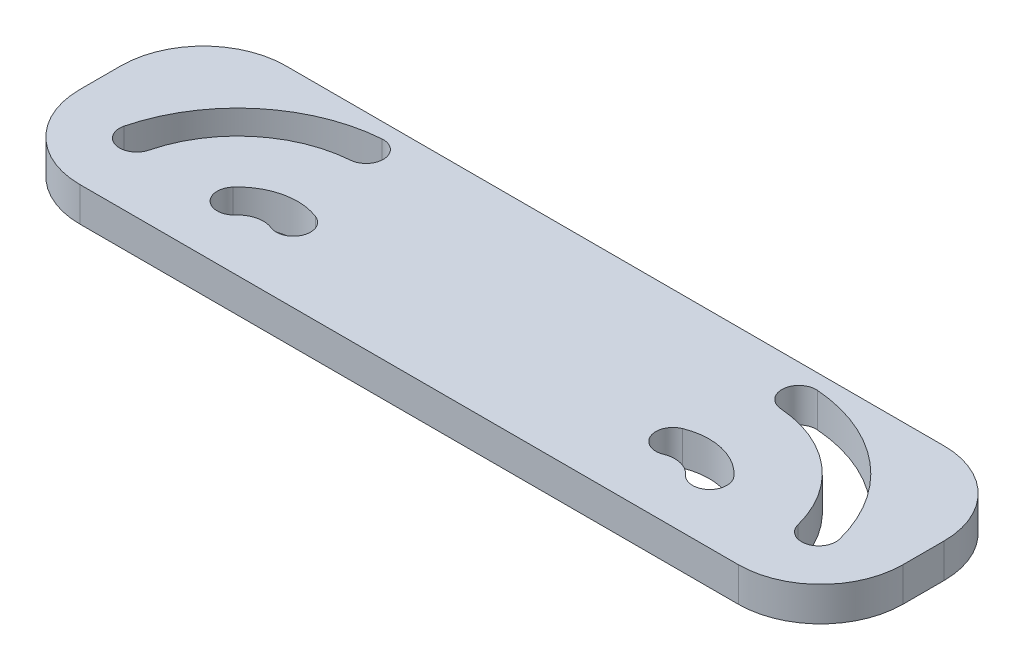
ISO-10303-21;
HEADER;
FILE_DESCRIPTION(('STEP AP214'),'2;1');
FILE_NAME('part.step','',(''),(''),'','','');
FILE_SCHEMA(('AUTOMOTIVE_DESIGN { 1 0 10303 214 1 1 1 1 }'));
ENDSEC;
DATA;
#1=APPLICATION_CONTEXT('core data for automotive mechanical design processes');
#2=APPLICATION_PROTOCOL_DEFINITION('international standard','automotive_design',2000,#1);
#3=PRODUCT_CONTEXT('',#1,'mechanical');
#4=PRODUCT('Part','Part','',(#3));
#5=PRODUCT_RELATED_PRODUCT_CATEGORY('part','',(#4));
#6=PRODUCT_DEFINITION_FORMATION('','',#4);
#7=PRODUCT_DEFINITION_CONTEXT('part definition',#1,'design');
#8=PRODUCT_DEFINITION('design','',#6,#7);
#9=PRODUCT_DEFINITION_SHAPE('','',#8);
#10=(LENGTH_UNIT() NAMED_UNIT(*) SI_UNIT(.MILLI.,.METRE.));
#11=(NAMED_UNIT(*) PLANE_ANGLE_UNIT() SI_UNIT($,.RADIAN.));
#12=(NAMED_UNIT(*) SI_UNIT($,.STERADIAN.) SOLID_ANGLE_UNIT());
#13=UNCERTAINTY_MEASURE_WITH_UNIT(LENGTH_MEASURE(1.E-05),#10,'distance_accuracy_value','');
#14=(GEOMETRIC_REPRESENTATION_CONTEXT(3) GLOBAL_UNCERTAINTY_ASSIGNED_CONTEXT((#13)) GLOBAL_UNIT_ASSIGNED_CONTEXT((#10,
#11,#12)) REPRESENTATION_CONTEXT('',''));
#15=CARTESIAN_POINT('',(0.,0.,0.));
#16=DIRECTION('',(0.,0.,1.));
#17=DIRECTION('',(1.,0.,0.));
#18=AXIS2_PLACEMENT_3D('',#15,#16,#17);
#19=CARTESIAN_POINT('',(38.1,3.175,-9.525));
#20=DIRECTION('',(-1.,0.,0.));
#21=DIRECTION('',(0.,0.,1.));
#22=AXIS2_PLACEMENT_3D('',#19,#20,#21);
#23=PLANE('',#22);
#24=DIRECTION('',(0.,0.,-1.));
#25=VECTOR('',#24,1.);
#26=CARTESIAN_POINT('',(38.1,0.,-9.525));
#27=LINE('',#26,#25);
#28=CARTESIAN_POINT('',(38.1,0.,1.905));
#29=VERTEX_POINT('',#28);
#30=CARTESIAN_POINT('',(38.1,0.,-1.905));
#31=VERTEX_POINT('',#30);
#32=EDGE_CURVE('E327',#29,#31,#27,.T.);
#33=ORIENTED_EDGE('',*,*,#32,.T.);
#34=DIRECTION('',(0.,-1.,0.));
#35=VECTOR('',#34,1.);
#36=CARTESIAN_POINT('',(38.1,3.175,-1.905));
#37=LINE('',#36,#35);
#38=CARTESIAN_POINT('',(38.1,3.175,-1.905));
#39=VERTEX_POINT('',#38);
#40=EDGE_CURVE('E382',#31,#39,#37,.F.);
#41=ORIENTED_EDGE('',*,*,#40,.T.);
#42=DIRECTION('',(0.,0.,-1.));
#43=VECTOR('',#42,1.);
#44=CARTESIAN_POINT('',(38.1,3.175,-9.525));
#45=LINE('',#44,#43);
#46=CARTESIAN_POINT('',(38.1,3.175,1.905));
#47=VERTEX_POINT('',#46);
#48=EDGE_CURVE('E334',#47,#39,#45,.T.);
#49=ORIENTED_EDGE('',*,*,#48,.F.);
#50=DIRECTION('',(0.,-1.,0.));
#51=VECTOR('',#50,1.);
#52=CARTESIAN_POINT('',(38.1,3.175,1.905));
#53=LINE('',#52,#51);
#54=EDGE_CURVE('E379',#47,#29,#53,.T.);
#55=ORIENTED_EDGE('',*,*,#54,.T.);
#56=EDGE_LOOP('',(#33,#41,#49,#55));
#57=FACE_BOUND('',#56,.T.);
#58=ADVANCED_FACE('F33',(#57),#23,.F.);
#59=CARTESIAN_POINT('',(-38.1,3.175,-9.525));
#60=DIRECTION('',(0.,0.,1.));
#61=DIRECTION('',(1.,0.,0.));
#62=AXIS2_PLACEMENT_3D('',#59,#60,#61);
#63=PLANE('',#62);
#64=DIRECTION('',(-1.,0.,0.));
#65=VECTOR('',#64,1.);
#66=CARTESIAN_POINT('',(-38.1,0.,-9.525));
#67=LINE('',#66,#65);
#68=CARTESIAN_POINT('',(30.48,0.,-9.525));
#69=VERTEX_POINT('',#68);
#70=CARTESIAN_POINT('',(-30.48,0.,-9.525));
#71=VERTEX_POINT('',#70);
#72=EDGE_CURVE('E348',#69,#71,#67,.T.);
#73=ORIENTED_EDGE('',*,*,#72,.T.);
#74=DIRECTION('',(0.,-1.,0.));
#75=VECTOR('',#74,1.);
#76=CARTESIAN_POINT('',(-30.48,3.175,-9.525));
#77=LINE('',#76,#75);
#78=CARTESIAN_POINT('',(-30.48,3.175,-9.525));
#79=VERTEX_POINT('',#78);
#80=EDGE_CURVE('E370',#71,#79,#77,.F.);
#81=ORIENTED_EDGE('',*,*,#80,.T.);
#82=DIRECTION('',(-1.,0.,0.));
#83=VECTOR('',#82,1.);
#84=CARTESIAN_POINT('',(-38.1,3.175,-9.525));
#85=LINE('',#84,#83);
#86=CARTESIAN_POINT('',(30.48,3.175,-9.525));
#87=VERTEX_POINT('',#86);
#88=EDGE_CURVE('E337',#87,#79,#85,.T.);
#89=ORIENTED_EDGE('',*,*,#88,.F.);
#90=DIRECTION('',(0.,-1.,0.));
#91=VECTOR('',#90,1.);
#92=CARTESIAN_POINT('',(30.48,3.175,-9.525));
#93=LINE('',#92,#91);
#94=EDGE_CURVE('E367',#87,#69,#93,.T.);
#95=ORIENTED_EDGE('',*,*,#94,.T.);
#96=EDGE_LOOP('',(#73,#81,#89,#95));
#97=FACE_BOUND('',#96,.T.);
#98=ADVANCED_FACE('F406',(#97),#63,.F.);
#99=CARTESIAN_POINT('',(-38.1,3.175,-9.525));
#100=DIRECTION('',(1.,0.,0.));
#101=DIRECTION('',(0.,0.,-1.));
#102=AXIS2_PLACEMENT_3D('',#99,#100,#101);
#103=PLANE('',#102);
#104=DIRECTION('',(0.,0.,1.));
#105=VECTOR('',#104,1.);
#106=CARTESIAN_POINT('',(-38.1,3.175,-9.525));
#107=LINE('',#106,#105);
#108=CARTESIAN_POINT('',(-38.1,3.175,-1.905));
#109=VERTEX_POINT('',#108);
#110=CARTESIAN_POINT('',(-38.1,3.175,1.905));
#111=VERTEX_POINT('',#110);
#112=EDGE_CURVE('E341',#109,#111,#107,.T.);
#113=ORIENTED_EDGE('',*,*,#112,.F.);
#114=DIRECTION('',(0.,-1.,0.));
#115=VECTOR('',#114,1.);
#116=CARTESIAN_POINT('',(-38.1,3.175,-1.905));
#117=LINE('',#116,#115);
#118=CARTESIAN_POINT('',(-38.1,0.,-1.905));
#119=VERTEX_POINT('',#118);
#120=EDGE_CURVE('E356',#109,#119,#117,.T.);
#121=ORIENTED_EDGE('',*,*,#120,.T.);
#122=DIRECTION('',(0.,0.,1.));
#123=VECTOR('',#122,1.);
#124=CARTESIAN_POINT('',(-38.1,0.,-9.525));
#125=LINE('',#124,#123);
#126=CARTESIAN_POINT('',(-38.1,0.,1.905));
#127=VERTEX_POINT('',#126);
#128=EDGE_CURVE('E351',#119,#127,#125,.T.);
#129=ORIENTED_EDGE('',*,*,#128,.T.);
#130=DIRECTION('',(0.,-1.,0.));
#131=VECTOR('',#130,1.);
#132=CARTESIAN_POINT('',(-38.1,3.175,1.905));
#133=LINE('',#132,#131);
#134=EDGE_CURVE('E345',#127,#111,#133,.F.);
#135=ORIENTED_EDGE('',*,*,#134,.T.);
#136=EDGE_LOOP('',(#113,#121,#129,#135));
#137=FACE_BOUND('',#136,.T.);
#138=ADVANCED_FACE('F414',(#137),#103,.F.);
#139=CARTESIAN_POINT('',(-38.1,3.175,9.525));
#140=DIRECTION('',(0.,0.,-1.));
#141=DIRECTION('',(-1.,0.,0.));
#142=AXIS2_PLACEMENT_3D('',#139,#140,#141);
#143=PLANE('',#142);
#144=DIRECTION('',(1.,0.,0.));
#145=VECTOR('',#144,1.);
#146=CARTESIAN_POINT('',(-38.1,0.,9.525));
#147=LINE('',#146,#145);
#148=CARTESIAN_POINT('',(-30.48,0.,9.525));
#149=VERTEX_POINT('',#148);
#150=CARTESIAN_POINT('',(30.48,0.,9.525));
#151=VERTEX_POINT('',#150);
#152=EDGE_CURVE('E338',#149,#151,#147,.T.);
#153=ORIENTED_EDGE('',*,*,#152,.T.);
#154=DIRECTION('',(0.,-1.,0.));
#155=VECTOR('',#154,1.);
#156=CARTESIAN_POINT('',(30.48,3.175,9.525));
#157=LINE('',#156,#155);
#158=CARTESIAN_POINT('',(30.48,3.175,9.525));
#159=VERTEX_POINT('',#158);
#160=EDGE_CURVE('E11',#151,#159,#157,.F.);
#161=ORIENTED_EDGE('',*,*,#160,.T.);
#162=DIRECTION('',(1.,0.,0.));
#163=VECTOR('',#162,1.);
#164=CARTESIAN_POINT('',(-38.1,3.175,9.525));
#165=LINE('',#164,#163);
#166=CARTESIAN_POINT('',(-30.48,3.175,9.525));
#167=VERTEX_POINT('',#166);
#168=EDGE_CURVE('E343',#167,#159,#165,.T.);
#169=ORIENTED_EDGE('',*,*,#168,.F.);
#170=DIRECTION('',(0.,-1.,0.));
#171=VECTOR('',#170,1.);
#172=CARTESIAN_POINT('',(-30.48,3.175,9.525));
#173=LINE('',#172,#171);
#174=EDGE_CURVE('E41',#167,#149,#173,.T.);
#175=ORIENTED_EDGE('',*,*,#174,.T.);
#176=EDGE_LOOP('',(#153,#161,#169,#175));
#177=FACE_BOUND('',#176,.T.);
#178=ADVANCED_FACE('F386',(#177),#143,.F.);
#179=CARTESIAN_POINT('',(0.,3.175,0.));
#180=DIRECTION('',(0.,1.,0.));
#181=DIRECTION('',(0.,0.,1.));
#182=AXIS2_PLACEMENT_3D('',#179,#180,#181);
#183=PLANE('',#182);
#184=CARTESIAN_POINT('',(-17.5716395943497,3.175,2.66687265038182));
#185=DIRECTION('',(0.,1.,0.));
#186=DIRECTION('',(0.,0.,1.));
#187=AXIS2_PLACEMENT_3D('',#184,#185,#186);
#188=CIRCLE('',#187,1.5875);
#189=CARTESIAN_POINT('',(-18.1629837566098,3.175,4.1401235902291));
#190=VERTEX_POINT('',#189);
#191=CARTESIAN_POINT('',(-16.9802954320896,3.175,1.19362171053455));
#192=VERTEX_POINT('',#191);
#193=EDGE_CURVE('E252',#190,#192,#188,.T.);
#194=ORIENTED_EDGE('',*,*,#193,.F.);
#195=CARTESIAN_POINT('',(-19.05,3.175,6.35));
#196=DIRECTION('',(0.,-1.,0.));
#197=DIRECTION('',(0.,0.,1.));
#198=AXIS2_PLACEMENT_3D('',#195,#196,#197);
#199=CIRCLE('',#198,2.38124999999999);
#200=CARTESIAN_POINT('',(-20.8232271324141,3.175,4.76065513516717));
#201=VERTEX_POINT('',#200);
#202=EDGE_CURVE('E242',#201,#190,#199,.T.);
#203=ORIENTED_EDGE('',*,*,#202,.F.);
#204=CARTESIAN_POINT('',(-22.0053785540235,3.175,3.70109189194528));
#205=DIRECTION('',(0.,1.,0.));
#206=DIRECTION('',(0.,0.,1.));
#207=AXIS2_PLACEMENT_3D('',#204,#205,#206);
#208=CIRCLE('',#207,1.5875);
#209=CARTESIAN_POINT('',(-23.1875299756329,3.175,2.64152864872338));
#210=VERTEX_POINT('',#209);
#211=EDGE_CURVE('E258',#210,#201,#208,.T.);
#212=ORIENTED_EDGE('',*,*,#211,.F.);
#213=CARTESIAN_POINT('',(-19.05,3.175,6.35));
#214=DIRECTION('',(0.,1.,0.));
#215=DIRECTION('',(0.,0.,1.));
#216=AXIS2_PLACEMENT_3D('',#213,#214,#215);
#217=CIRCLE('',#216,5.55624999999999);
#218=EDGE_CURVE('E254',#192,#210,#217,.T.);
#219=ORIENTED_EDGE('',*,*,#218,.F.);
#220=EDGE_LOOP('',(#194,#203,#212,#219));
#221=FACE_BOUND('',#220,.T.);
#222=CARTESIAN_POINT('',(17.5716395943497,3.175,2.66687265038182));
#223=DIRECTION('',(0.,1.,0.));
#224=DIRECTION('',(0.,0.,-1.));
#225=AXIS2_PLACEMENT_3D('',#222,#223,#224);
#226=CIRCLE('',#225,1.5875);
#227=CARTESIAN_POINT('',(16.9802954320896,3.175,1.19362171053454));
#228=VERTEX_POINT('',#227);
#229=CARTESIAN_POINT('',(18.1629837566098,3.175,4.1401235902291));
#230=VERTEX_POINT('',#229);
#231=EDGE_CURVE('E234',#228,#230,#226,.T.);
#232=ORIENTED_EDGE('',*,*,#231,.F.);
#233=CARTESIAN_POINT('',(19.05,3.175,6.35));
#234=DIRECTION('',(0.,1.,0.));
#235=DIRECTION('',(0.,0.,-1.));
#236=AXIS2_PLACEMENT_3D('',#233,#234,#235);
#237=CIRCLE('',#236,5.55625);
#238=CARTESIAN_POINT('',(23.1875299756329,3.175,2.64152864872338));
#239=VERTEX_POINT('',#238);
#240=EDGE_CURVE('E276',#239,#228,#237,.T.);
#241=ORIENTED_EDGE('',*,*,#240,.F.);
#242=CARTESIAN_POINT('',(22.0053785540235,3.175,3.70109189194527));
#243=DIRECTION('',(0.,1.,0.));
#244=DIRECTION('',(0.,0.,-1.));
#245=AXIS2_PLACEMENT_3D('',#242,#243,#244);
#246=CIRCLE('',#245,1.5875);
#247=CARTESIAN_POINT('',(20.8232271324141,3.175,4.76065513516717));
#248=VERTEX_POINT('',#247);
#249=EDGE_CURVE('E290',#248,#239,#246,.T.);
#250=ORIENTED_EDGE('',*,*,#249,.F.);
#251=CARTESIAN_POINT('',(19.05,3.175,6.35));
#252=DIRECTION('',(0.,-1.,0.));
#253=DIRECTION('',(0.,0.,-1.));
#254=AXIS2_PLACEMENT_3D('',#251,#252,#253);
#255=CIRCLE('',#254,2.38124999999999);
#256=EDGE_CURVE('E287',#230,#248,#255,.T.);
#257=ORIENTED_EDGE('',*,*,#256,.F.);
#258=EDGE_LOOP('',(#232,#241,#250,#257));
#259=FACE_BOUND('',#258,.T.);
#260=CARTESIAN_POINT('',(20.0368909989513,3.175,-6.53357084502152));
#261=DIRECTION('',(0.,1.,0.));
#262=DIRECTION('',(0.,0.,-1.));
#263=AXIS2_PLACEMENT_3D('',#260,#261,#262);
#264=CIRCLE('',#263,1.5875);
#265=CARTESIAN_POINT('',(20.158139463252,3.175,-8.11643377651771));
#266=VERTEX_POINT('',#265);
#267=CARTESIAN_POINT('',(19.9156425346507,3.175,-4.95070791352532));
#268=VERTEX_POINT('',#267);
#269=EDGE_CURVE('E201',#266,#268,#264,.T.);
#270=ORIENTED_EDGE('',*,*,#269,.F.);
#271=CARTESIAN_POINT('',(19.05,3.175,6.35));
#272=DIRECTION('',(0.,1.,0.));
#273=DIRECTION('',(0.,0.,-1.));
#274=AXIS2_PLACEMENT_3D('',#271,#272,#273);
#275=CIRCLE('',#274,14.5088138481541);
#276=CARTESIAN_POINT('',(33.1139931178232,3.175,2.78492260081044));
#277=VERTEX_POINT('',#276);
#278=EDGE_CURVE('E219',#277,#266,#275,.T.);
#279=ORIENTED_EDGE('',*,*,#278,.F.);
#280=CARTESIAN_POINT('',(31.5751637339597,3.175,3.17499999999999));
#281=DIRECTION('',(0.,1.,0.));
#282=DIRECTION('',(0.,0.,-1.));
#283=AXIS2_PLACEMENT_3D('',#280,#281,#282);
#284=CIRCLE('',#283,1.58749999999999);
#285=CARTESIAN_POINT('',(30.0363343500963,3.175,3.56507739918955));
#286=VERTEX_POINT('',#285);
#287=EDGE_CURVE('E222',#286,#277,#284,.T.);
#288=ORIENTED_EDGE('',*,*,#287,.F.);
#289=CARTESIAN_POINT('',(19.05,3.175,6.35));
#290=DIRECTION('',(0.,-1.,0.));
#291=DIRECTION('',(0.,0.,-1.));
#292=AXIS2_PLACEMENT_3D('',#289,#290,#291);
#293=CIRCLE('',#292,11.3338138481541);
#294=EDGE_CURVE('E228',#268,#286,#293,.T.);
#295=ORIENTED_EDGE('',*,*,#294,.F.);
#296=EDGE_LOOP('',(#270,#279,#288,#295));
#297=FACE_BOUND('',#296,.T.);
#298=CARTESIAN_POINT('',(-20.0368909989513,3.175,-6.53357084502152));
#299=DIRECTION('',(0.,1.,0.));
#300=DIRECTION('',(0.,0.,1.));
#301=AXIS2_PLACEMENT_3D('',#298,#299,#300);
#302=CIRCLE('',#301,1.5875);
#303=CARTESIAN_POINT('',(-19.9156425346507,3.175,-4.95070791352532));
#304=VERTEX_POINT('',#303);
#305=CARTESIAN_POINT('',(-20.158139463252,3.175,-8.11643377651771));
#306=VERTEX_POINT('',#305);
#307=EDGE_CURVE('E265',#304,#306,#302,.T.);
#308=ORIENTED_EDGE('',*,*,#307,.F.);
#309=CARTESIAN_POINT('',(-19.05,3.175,6.35));
#310=DIRECTION('',(0.,-1.,0.));
#311=DIRECTION('',(0.,0.,1.));
#312=AXIS2_PLACEMENT_3D('',#309,#310,#311);
#313=CIRCLE('',#312,11.3338138481541);
#314=CARTESIAN_POINT('',(-30.0363343500963,3.175,3.56507739918956));
#315=VERTEX_POINT('',#314);
#316=EDGE_CURVE('E306',#315,#304,#313,.T.);
#317=ORIENTED_EDGE('',*,*,#316,.F.);
#318=CARTESIAN_POINT('',(-31.5751637339597,3.175,3.175));
#319=DIRECTION('',(0.,1.,0.));
#320=DIRECTION('',(0.,0.,1.));
#321=AXIS2_PLACEMENT_3D('',#318,#319,#320);
#322=CIRCLE('',#321,1.5875);
#323=CARTESIAN_POINT('',(-33.1139931178231,3.175,2.78492260081044));
#324=VERTEX_POINT('',#323);
#325=EDGE_CURVE('E320',#324,#315,#322,.T.);
#326=ORIENTED_EDGE('',*,*,#325,.F.);
#327=CARTESIAN_POINT('',(-19.05,3.175,6.35));
#328=DIRECTION('',(0.,1.,0.));
#329=DIRECTION('',(0.,0.,1.));
#330=AXIS2_PLACEMENT_3D('',#327,#328,#329);
#331=CIRCLE('',#330,14.5088138481541);
#332=EDGE_CURVE('E317',#306,#324,#331,.T.);
#333=ORIENTED_EDGE('',*,*,#332,.F.);
#334=EDGE_LOOP('',(#308,#317,#326,#333));
#335=FACE_BOUND('',#334,.T.);
#336=ORIENTED_EDGE('',*,*,#88,.T.);
#337=CARTESIAN_POINT('',(-30.48,3.175,-1.905));
#338=DIRECTION('',(0.,1.,0.));
#339=DIRECTION('',(0.,0.,1.));
#340=AXIS2_PLACEMENT_3D('',#337,#338,#339);
#341=CIRCLE('',#340,7.62);
#342=EDGE_CURVE('E377',#79,#109,#341,.T.);
#343=ORIENTED_EDGE('',*,*,#342,.T.);
#344=ORIENTED_EDGE('',*,*,#112,.T.);
#345=CARTESIAN_POINT('',(-30.48,3.175,1.905));
#346=DIRECTION('',(0.,1.,0.));
#347=DIRECTION('',(0.,0.,1.));
#348=AXIS2_PLACEMENT_3D('',#345,#346,#347);
#349=CIRCLE('',#348,7.62);
#350=EDGE_CURVE('E53',#111,#167,#349,.T.);
#351=ORIENTED_EDGE('',*,*,#350,.T.);
#352=ORIENTED_EDGE('',*,*,#168,.T.);
#353=CARTESIAN_POINT('',(30.48,3.175,1.905));
#354=DIRECTION('',(0.,1.,0.));
#355=DIRECTION('',(0.,0.,1.));
#356=AXIS2_PLACEMENT_3D('',#353,#354,#355);
#357=CIRCLE('',#356,7.62);
#358=EDGE_CURVE('E373',#159,#47,#357,.T.);
#359=ORIENTED_EDGE('',*,*,#358,.T.);
#360=ORIENTED_EDGE('',*,*,#48,.T.);
#361=CARTESIAN_POINT('',(30.48,3.175,-1.905));
#362=DIRECTION('',(0.,1.,0.));
#363=DIRECTION('',(0.,0.,1.));
#364=AXIS2_PLACEMENT_3D('',#361,#362,#363);
#365=CIRCLE('',#364,7.62);
#366=EDGE_CURVE('E375',#39,#87,#365,.T.);
#367=ORIENTED_EDGE('',*,*,#366,.T.);
#368=EDGE_LOOP('',(#336,#343,#344,#351,#352,#359,#360,#367));
#369=FACE_BOUND('',#368,.T.);
#370=ADVANCED_FACE('F399',(#221,#259,#297,#335,#369),#183,.T.);
#371=CARTESIAN_POINT('',(0.,0.,0.));
#372=DIRECTION('',(0.,1.,0.));
#373=DIRECTION('',(0.,0.,1.));
#374=AXIS2_PLACEMENT_3D('',#371,#372,#373);
#375=PLANE('',#374);
#376=CARTESIAN_POINT('',(-19.05,0.,6.35));
#377=DIRECTION('',(0.,-1.,0.));
#378=DIRECTION('',(0.,0.,1.));
#379=AXIS2_PLACEMENT_3D('',#376,#377,#378);
#380=CIRCLE('',#379,2.38124999999999);
#381=CARTESIAN_POINT('',(-20.8232271324141,0.,4.76065513516717));
#382=VERTEX_POINT('',#381);
#383=CARTESIAN_POINT('',(-18.1629837566098,0.,4.1401235902291));
#384=VERTEX_POINT('',#383);
#385=EDGE_CURVE('E248',#382,#384,#380,.T.);
#386=ORIENTED_EDGE('',*,*,#385,.T.);
#387=CARTESIAN_POINT('',(-17.5716395943497,0.,2.66687265038182));
#388=DIRECTION('',(0.,1.,0.));
#389=DIRECTION('',(0.,0.,1.));
#390=AXIS2_PLACEMENT_3D('',#387,#388,#389);
#391=CIRCLE('',#390,1.5875);
#392=CARTESIAN_POINT('',(-16.9802954320896,0.,1.19362171053455));
#393=VERTEX_POINT('',#392);
#394=EDGE_CURVE('E238',#384,#393,#391,.T.);
#395=ORIENTED_EDGE('',*,*,#394,.T.);
#396=CARTESIAN_POINT('',(-19.05,0.,6.35));
#397=DIRECTION('',(0.,1.,0.));
#398=DIRECTION('',(0.,0.,1.));
#399=AXIS2_PLACEMENT_3D('',#396,#397,#398);
#400=CIRCLE('',#399,5.55624999999999);
#401=CARTESIAN_POINT('',(-23.1875299756329,0.,2.64152864872338));
#402=VERTEX_POINT('',#401);
#403=EDGE_CURVE('E241',#393,#402,#400,.T.);
#404=ORIENTED_EDGE('',*,*,#403,.T.);
#405=CARTESIAN_POINT('',(-22.0053785540235,0.,3.70109189194528));
#406=DIRECTION('',(0.,1.,0.));
#407=DIRECTION('',(0.,0.,1.));
#408=AXIS2_PLACEMENT_3D('',#405,#406,#407);
#409=CIRCLE('',#408,1.5875);
#410=EDGE_CURVE('E245',#402,#382,#409,.T.);
#411=ORIENTED_EDGE('',*,*,#410,.T.);
#412=EDGE_LOOP('',(#386,#395,#404,#411));
#413=FACE_BOUND('',#412,.T.);
#414=CARTESIAN_POINT('',(19.05,0.,6.35));
#415=DIRECTION('',(0.,1.,0.));
#416=DIRECTION('',(0.,0.,-1.));
#417=AXIS2_PLACEMENT_3D('',#414,#415,#416);
#418=CIRCLE('',#417,5.55625);
#419=CARTESIAN_POINT('',(23.1875299756329,0.,2.64152864872338));
#420=VERTEX_POINT('',#419);
#421=CARTESIAN_POINT('',(16.9802954320896,0.,1.19362171053454));
#422=VERTEX_POINT('',#421);
#423=EDGE_CURVE('E282',#420,#422,#418,.T.);
#424=ORIENTED_EDGE('',*,*,#423,.T.);
#425=CARTESIAN_POINT('',(17.5716395943497,0.,2.66687265038182));
#426=DIRECTION('',(0.,1.,0.));
#427=DIRECTION('',(0.,0.,-1.));
#428=AXIS2_PLACEMENT_3D('',#425,#426,#427);
#429=CIRCLE('',#428,1.5875);
#430=CARTESIAN_POINT('',(18.1629837566098,0.,4.1401235902291));
#431=VERTEX_POINT('',#430);
#432=EDGE_CURVE('E272',#422,#431,#429,.T.);
#433=ORIENTED_EDGE('',*,*,#432,.T.);
#434=CARTESIAN_POINT('',(19.05,0.,6.35));
#435=DIRECTION('',(0.,-1.,0.));
#436=DIRECTION('',(0.,0.,-1.));
#437=AXIS2_PLACEMENT_3D('',#434,#435,#436);
#438=CIRCLE('',#437,2.38124999999999);
#439=CARTESIAN_POINT('',(20.8232271324141,0.,4.76065513516717));
#440=VERTEX_POINT('',#439);
#441=EDGE_CURVE('E275',#431,#440,#438,.T.);
#442=ORIENTED_EDGE('',*,*,#441,.T.);
#443=CARTESIAN_POINT('',(22.0053785540235,0.,3.70109189194527));
#444=DIRECTION('',(0.,1.,0.));
#445=DIRECTION('',(0.,0.,-1.));
#446=AXIS2_PLACEMENT_3D('',#443,#444,#445);
#447=CIRCLE('',#446,1.5875);
#448=EDGE_CURVE('E279',#440,#420,#447,.T.);
#449=ORIENTED_EDGE('',*,*,#448,.T.);
#450=EDGE_LOOP('',(#424,#433,#442,#449));
#451=FACE_BOUND('',#450,.T.);
#452=CARTESIAN_POINT('',(19.05,0.,6.35));
#453=DIRECTION('',(0.,1.,0.));
#454=DIRECTION('',(0.,0.,-1.));
#455=AXIS2_PLACEMENT_3D('',#452,#453,#454);
#456=CIRCLE('',#455,14.5088138481541);
#457=CARTESIAN_POINT('',(33.1139931178232,0.,2.78492260081044));
#458=VERTEX_POINT('',#457);
#459=CARTESIAN_POINT('',(20.158139463252,0.,-8.11643377651771));
#460=VERTEX_POINT('',#459);
#461=EDGE_CURVE('E206',#458,#460,#456,.T.);
#462=ORIENTED_EDGE('',*,*,#461,.T.);
#463=CARTESIAN_POINT('',(20.0368909989513,0.,-6.53357084502152));
#464=DIRECTION('',(0.,1.,0.));
#465=DIRECTION('',(0.,0.,-1.));
#466=AXIS2_PLACEMENT_3D('',#463,#464,#465);
#467=CIRCLE('',#466,1.5875);
#468=CARTESIAN_POINT('',(19.9156425346507,0.,-4.95070791352533));
#469=VERTEX_POINT('',#468);
#470=EDGE_CURVE('E198',#460,#469,#467,.T.);
#471=ORIENTED_EDGE('',*,*,#470,.T.);
#472=CARTESIAN_POINT('',(19.05,0.,6.35));
#473=DIRECTION('',(0.,-1.,0.));
#474=DIRECTION('',(0.,0.,-1.));
#475=AXIS2_PLACEMENT_3D('',#472,#473,#474);
#476=CIRCLE('',#475,11.3338138481541);
#477=CARTESIAN_POINT('',(30.0363343500963,0.,3.56507739918956));
#478=VERTEX_POINT('',#477);
#479=EDGE_CURVE('E210',#469,#478,#476,.T.);
#480=ORIENTED_EDGE('',*,*,#479,.T.);
#481=CARTESIAN_POINT('',(31.5751637339597,0.,3.17499999999999));
#482=DIRECTION('',(0.,1.,0.));
#483=DIRECTION('',(0.,0.,-1.));
#484=AXIS2_PLACEMENT_3D('',#481,#482,#483);
#485=CIRCLE('',#484,1.58749999999999);
#486=EDGE_CURVE('E214',#478,#458,#485,.T.);
#487=ORIENTED_EDGE('',*,*,#486,.T.);
#488=EDGE_LOOP('',(#462,#471,#480,#487));
#489=FACE_BOUND('',#488,.T.);
#490=CARTESIAN_POINT('',(-19.05,0.,6.35));
#491=DIRECTION('',(0.,-1.,0.));
#492=DIRECTION('',(0.,0.,1.));
#493=AXIS2_PLACEMENT_3D('',#490,#491,#492);
#494=CIRCLE('',#493,11.3338138481541);
#495=CARTESIAN_POINT('',(-30.0363343500963,0.,3.56507739918956));
#496=VERTEX_POINT('',#495);
#497=CARTESIAN_POINT('',(-19.9156425346507,0.,-4.95070791352532));
#498=VERTEX_POINT('',#497);
#499=EDGE_CURVE('E312',#496,#498,#494,.T.);
#500=ORIENTED_EDGE('',*,*,#499,.T.);
#501=CARTESIAN_POINT('',(-20.0368909989513,0.,-6.53357084502152));
#502=DIRECTION('',(0.,1.,0.));
#503=DIRECTION('',(0.,0.,1.));
#504=AXIS2_PLACEMENT_3D('',#501,#502,#503);
#505=CIRCLE('',#504,1.5875);
#506=CARTESIAN_POINT('',(-20.158139463252,0.,-8.11643377651771));
#507=VERTEX_POINT('',#506);
#508=EDGE_CURVE('E302',#498,#507,#505,.T.);
#509=ORIENTED_EDGE('',*,*,#508,.T.);
#510=CARTESIAN_POINT('',(-19.05,0.,6.35));
#511=DIRECTION('',(0.,1.,0.));
#512=DIRECTION('',(0.,0.,1.));
#513=AXIS2_PLACEMENT_3D('',#510,#511,#512);
#514=CIRCLE('',#513,14.5088138481541);
#515=CARTESIAN_POINT('',(-33.1139931178231,0.,2.78492260081044));
#516=VERTEX_POINT('',#515);
#517=EDGE_CURVE('E305',#507,#516,#514,.T.);
#518=ORIENTED_EDGE('',*,*,#517,.T.);
#519=CARTESIAN_POINT('',(-31.5751637339597,0.,3.175));
#520=DIRECTION('',(0.,1.,0.));
#521=DIRECTION('',(0.,0.,1.));
#522=AXIS2_PLACEMENT_3D('',#519,#520,#521);
#523=CIRCLE('',#522,1.5875);
#524=EDGE_CURVE('E309',#516,#496,#523,.T.);
#525=ORIENTED_EDGE('',*,*,#524,.T.);
#526=EDGE_LOOP('',(#500,#509,#518,#525));
#527=FACE_BOUND('',#526,.T.);
#528=ORIENTED_EDGE('',*,*,#128,.F.);
#529=CARTESIAN_POINT('',(-30.48,0.,-1.905));
#530=DIRECTION('',(0.,1.,0.));
#531=DIRECTION('',(0.,0.,1.));
#532=AXIS2_PLACEMENT_3D('',#529,#530,#531);
#533=CIRCLE('',#532,7.62);
#534=EDGE_CURVE('E365',#119,#71,#533,.F.);
#535=ORIENTED_EDGE('',*,*,#534,.T.);
#536=ORIENTED_EDGE('',*,*,#72,.F.);
#537=CARTESIAN_POINT('',(30.48,0.,-1.905));
#538=DIRECTION('',(0.,1.,0.));
#539=DIRECTION('',(0.,0.,1.));
#540=AXIS2_PLACEMENT_3D('',#537,#538,#539);
#541=CIRCLE('',#540,7.62);
#542=EDGE_CURVE('E363',#69,#31,#541,.F.);
#543=ORIENTED_EDGE('',*,*,#542,.T.);
#544=ORIENTED_EDGE('',*,*,#32,.F.);
#545=CARTESIAN_POINT('',(30.48,0.,1.905));
#546=DIRECTION('',(0.,1.,0.));
#547=DIRECTION('',(0.,0.,1.));
#548=AXIS2_PLACEMENT_3D('',#545,#546,#547);
#549=CIRCLE('',#548,7.62);
#550=EDGE_CURVE('E361',#29,#151,#549,.F.);
#551=ORIENTED_EDGE('',*,*,#550,.T.);
#552=ORIENTED_EDGE('',*,*,#152,.F.);
#553=CARTESIAN_POINT('',(-30.48,0.,1.905));
#554=DIRECTION('',(0.,1.,0.));
#555=DIRECTION('',(0.,0.,1.));
#556=AXIS2_PLACEMENT_3D('',#553,#554,#555);
#557=CIRCLE('',#556,7.62);
#558=EDGE_CURVE('E359',#149,#127,#557,.F.);
#559=ORIENTED_EDGE('',*,*,#558,.T.);
#560=EDGE_LOOP('',(#528,#535,#536,#543,#544,#551,#552,#559));
#561=FACE_BOUND('',#560,.T.);
#562=ADVANCED_FACE('F216',(#413,#451,#489,#527,#561),#375,.F.);
#563=CARTESIAN_POINT('',(-20.0368909989513,0.,-6.53357084502152));
#564=DIRECTION('',(0.,1.,0.));
#565=DIRECTION('',(0.,0.,1.));
#566=AXIS2_PLACEMENT_3D('',#563,#564,#565);
#567=CYLINDRICAL_SURFACE('',#566,1.5875);
#568=ORIENTED_EDGE('',*,*,#307,.T.);
#569=DIRECTION('',(0.,1.,0.));
#570=VECTOR('',#569,1.);
#571=CARTESIAN_POINT('',(-20.158139463252,0.,-8.11643377651771));
#572=LINE('',#571,#570);
#573=EDGE_CURVE('E315',#507,#306,#572,.T.);
#574=ORIENTED_EDGE('',*,*,#573,.F.);
#575=ORIENTED_EDGE('',*,*,#508,.F.);
#576=DIRECTION('',(0.,1.,0.));
#577=VECTOR('',#576,1.);
#578=CARTESIAN_POINT('',(-19.9156425346507,0.,-4.95070791352532));
#579=LINE('',#578,#577);
#580=EDGE_CURVE('E325',#498,#304,#579,.T.);
#581=ORIENTED_EDGE('',*,*,#580,.T.);
#582=EDGE_LOOP('',(#568,#574,#575,#581));
#583=FACE_BOUND('',#582,.T.);
#584=ADVANCED_FACE('F583',(#583),#567,.F.);
#585=CARTESIAN_POINT('',(-19.05,0.,6.35));
#586=DIRECTION('',(0.,1.,0.));
#587=DIRECTION('',(0.,0.,1.));
#588=AXIS2_PLACEMENT_3D('',#585,#586,#587);
#589=CYLINDRICAL_SURFACE('',#588,11.3338138481541);
#590=ORIENTED_EDGE('',*,*,#316,.T.);
#591=ORIENTED_EDGE('',*,*,#580,.F.);
#592=ORIENTED_EDGE('',*,*,#499,.F.);
#593=DIRECTION('',(0.,1.,0.));
#594=VECTOR('',#593,1.);
#595=CARTESIAN_POINT('',(-30.0363343500963,0.,3.56507739918956));
#596=LINE('',#595,#594);
#597=EDGE_CURVE('E328',#496,#315,#596,.T.);
#598=ORIENTED_EDGE('',*,*,#597,.T.);
#599=EDGE_LOOP('',(#590,#591,#592,#598));
#600=FACE_BOUND('',#599,.T.);
#601=ADVANCED_FACE('F574',(#600),#589,.T.);
#602=CARTESIAN_POINT('',(-31.5751637339597,0.,3.175));
#603=DIRECTION('',(0.,1.,0.));
#604=DIRECTION('',(0.,0.,1.));
#605=AXIS2_PLACEMENT_3D('',#602,#603,#604);
#606=CYLINDRICAL_SURFACE('',#605,1.5875);
#607=ORIENTED_EDGE('',*,*,#325,.T.);
#608=ORIENTED_EDGE('',*,*,#597,.F.);
#609=ORIENTED_EDGE('',*,*,#524,.F.);
#610=DIRECTION('',(0.,1.,0.));
#611=VECTOR('',#610,1.);
#612=CARTESIAN_POINT('',(-33.1139931178231,0.,2.78492260081044));
#613=LINE('',#612,#611);
#614=EDGE_CURVE('E330',#516,#324,#613,.T.);
#615=ORIENTED_EDGE('',*,*,#614,.T.);
#616=EDGE_LOOP('',(#607,#608,#609,#615));
#617=FACE_BOUND('',#616,.T.);
#618=ADVANCED_FACE('F565',(#617),#606,.F.);
#619=CARTESIAN_POINT('',(-19.05,0.,6.35));
#620=DIRECTION('',(0.,1.,0.));
#621=DIRECTION('',(0.,0.,1.));
#622=AXIS2_PLACEMENT_3D('',#619,#620,#621);
#623=CYLINDRICAL_SURFACE('',#622,14.5088138481541);
#624=ORIENTED_EDGE('',*,*,#332,.T.);
#625=ORIENTED_EDGE('',*,*,#614,.F.);
#626=ORIENTED_EDGE('',*,*,#517,.F.);
#627=ORIENTED_EDGE('',*,*,#573,.T.);
#628=EDGE_LOOP('',(#624,#625,#626,#627));
#629=FACE_BOUND('',#628,.T.);
#630=ADVANCED_FACE('F557',(#629),#623,.F.);
#631=CARTESIAN_POINT('',(20.0368909989513,0.,-6.53357084502152));
#632=DIRECTION('',(0.,1.,0.));
#633=DIRECTION('',(0.,0.,1.));
#634=AXIS2_PLACEMENT_3D('',#631,#632,#633);
#635=CYLINDRICAL_SURFACE('',#634,1.5875);
#636=ORIENTED_EDGE('',*,*,#269,.T.);
#637=DIRECTION('',(0.,1.,0.));
#638=VECTOR('',#637,1.);
#639=CARTESIAN_POINT('',(19.9156425346507,0.,-4.95070791352533));
#640=LINE('',#639,#638);
#641=EDGE_CURVE('E194',#469,#268,#640,.T.);
#642=ORIENTED_EDGE('',*,*,#641,.F.);
#643=ORIENTED_EDGE('',*,*,#470,.F.);
#644=DIRECTION('',(0.,1.,0.));
#645=VECTOR('',#644,1.);
#646=CARTESIAN_POINT('',(20.158139463252,0.,-8.11643377651771));
#647=LINE('',#646,#645);
#648=EDGE_CURVE('E232',#460,#266,#647,.T.);
#649=ORIENTED_EDGE('',*,*,#648,.T.);
#650=EDGE_LOOP('',(#636,#642,#643,#649));
#651=FACE_BOUND('',#650,.T.);
#652=ADVANCED_FACE('F196',(#651),#635,.F.);
#653=CARTESIAN_POINT('',(19.05,0.,6.35));
#654=DIRECTION('',(0.,1.,0.));
#655=DIRECTION('',(0.,0.,1.));
#656=AXIS2_PLACEMENT_3D('',#653,#654,#655);
#657=CYLINDRICAL_SURFACE('',#656,14.5088138481541);
#658=ORIENTED_EDGE('',*,*,#278,.T.);
#659=ORIENTED_EDGE('',*,*,#648,.F.);
#660=ORIENTED_EDGE('',*,*,#461,.F.);
#661=DIRECTION('',(0.,1.,0.));
#662=VECTOR('',#661,1.);
#663=CARTESIAN_POINT('',(33.1139931178232,0.,2.78492260081044));
#664=LINE('',#663,#662);
#665=EDGE_CURVE('E235',#458,#277,#664,.T.);
#666=ORIENTED_EDGE('',*,*,#665,.T.);
#667=EDGE_LOOP('',(#658,#659,#660,#666));
#668=FACE_BOUND('',#667,.T.);
#669=ADVANCED_FACE('F540',(#668),#657,.F.);
#670=CARTESIAN_POINT('',(31.5751637339597,0.,3.17499999999999));
#671=DIRECTION('',(0.,1.,0.));
#672=DIRECTION('',(0.,0.,1.));
#673=AXIS2_PLACEMENT_3D('',#670,#671,#672);
#674=CYLINDRICAL_SURFACE('',#673,1.58749999999999);
#675=ORIENTED_EDGE('',*,*,#287,.T.);
#676=ORIENTED_EDGE('',*,*,#665,.F.);
#677=ORIENTED_EDGE('',*,*,#486,.F.);
#678=DIRECTION('',(0.,1.,0.));
#679=VECTOR('',#678,1.);
#680=CARTESIAN_POINT('',(30.0363343500963,0.,3.56507739918955));
#681=LINE('',#680,#679);
#682=EDGE_CURVE('E205',#478,#286,#681,.T.);
#683=ORIENTED_EDGE('',*,*,#682,.T.);
#684=EDGE_LOOP('',(#675,#676,#677,#683));
#685=FACE_BOUND('',#684,.T.);
#686=ADVANCED_FACE('F532',(#685),#674,.F.);
#687=CARTESIAN_POINT('',(19.05,0.,6.35));
#688=DIRECTION('',(0.,1.,0.));
#689=DIRECTION('',(0.,0.,1.));
#690=AXIS2_PLACEMENT_3D('',#687,#688,#689);
#691=CYLINDRICAL_SURFACE('',#690,11.3338138481541);
#692=ORIENTED_EDGE('',*,*,#294,.T.);
#693=ORIENTED_EDGE('',*,*,#682,.F.);
#694=ORIENTED_EDGE('',*,*,#479,.F.);
#695=ORIENTED_EDGE('',*,*,#641,.T.);
#696=EDGE_LOOP('',(#692,#693,#694,#695));
#697=FACE_BOUND('',#696,.T.);
#698=ADVANCED_FACE('F211',(#697),#691,.T.);
#699=CARTESIAN_POINT('',(17.5716395943497,0.,2.66687265038182));
#700=DIRECTION('',(0.,1.,0.));
#701=DIRECTION('',(0.,0.,1.));
#702=AXIS2_PLACEMENT_3D('',#699,#700,#701);
#703=CYLINDRICAL_SURFACE('',#702,1.5875);
#704=ORIENTED_EDGE('',*,*,#231,.T.);
#705=DIRECTION('',(0.,1.,0.));
#706=VECTOR('',#705,1.);
#707=CARTESIAN_POINT('',(18.1629837566098,0.,4.1401235902291));
#708=LINE('',#707,#706);
#709=EDGE_CURVE('E285',#431,#230,#708,.T.);
#710=ORIENTED_EDGE('',*,*,#709,.F.);
#711=ORIENTED_EDGE('',*,*,#432,.F.);
#712=DIRECTION('',(0.,1.,0.));
#713=VECTOR('',#712,1.);
#714=CARTESIAN_POINT('',(16.9802954320896,0.,1.19362171053454));
#715=LINE('',#714,#713);
#716=EDGE_CURVE('E255',#422,#228,#715,.T.);
#717=ORIENTED_EDGE('',*,*,#716,.T.);
#718=EDGE_LOOP('',(#704,#710,#711,#717));
#719=FACE_BOUND('',#718,.T.);
#720=ADVANCED_FACE('F515',(#719),#703,.F.);
#721=CARTESIAN_POINT('',(19.05,0.,6.35));
#722=DIRECTION('',(0.,1.,0.));
#723=DIRECTION('',(0.,0.,1.));
#724=AXIS2_PLACEMENT_3D('',#721,#722,#723);
#725=CYLINDRICAL_SURFACE('',#724,5.55625);
#726=ORIENTED_EDGE('',*,*,#240,.T.);
#727=ORIENTED_EDGE('',*,*,#716,.F.);
#728=ORIENTED_EDGE('',*,*,#423,.F.);
#729=DIRECTION('',(0.,1.,0.));
#730=VECTOR('',#729,1.);
#731=CARTESIAN_POINT('',(23.1875299756329,0.,2.64152864872338));
#732=LINE('',#731,#730);
#733=EDGE_CURVE('E296',#420,#239,#732,.T.);
#734=ORIENTED_EDGE('',*,*,#733,.T.);
#735=EDGE_LOOP('',(#726,#727,#728,#734));
#736=FACE_BOUND('',#735,.T.);
#737=ADVANCED_FACE('F506',(#736),#725,.F.);
#738=CARTESIAN_POINT('',(22.0053785540235,0.,3.70109189194527));
#739=DIRECTION('',(0.,1.,0.));
#740=DIRECTION('',(0.,0.,1.));
#741=AXIS2_PLACEMENT_3D('',#738,#739,#740);
#742=CYLINDRICAL_SURFACE('',#741,1.5875);
#743=ORIENTED_EDGE('',*,*,#249,.T.);
#744=ORIENTED_EDGE('',*,*,#733,.F.);
#745=ORIENTED_EDGE('',*,*,#448,.F.);
#746=DIRECTION('',(0.,1.,0.));
#747=VECTOR('',#746,1.);
#748=CARTESIAN_POINT('',(20.8232271324141,0.,4.76065513516717));
#749=LINE('',#748,#747);
#750=EDGE_CURVE('E298',#440,#248,#749,.T.);
#751=ORIENTED_EDGE('',*,*,#750,.T.);
#752=EDGE_LOOP('',(#743,#744,#745,#751));
#753=FACE_BOUND('',#752,.T.);
#754=ADVANCED_FACE('F497',(#753),#742,.F.);
#755=CARTESIAN_POINT('',(19.05,0.,6.35));
#756=DIRECTION('',(0.,1.,0.));
#757=DIRECTION('',(0.,0.,1.));
#758=AXIS2_PLACEMENT_3D('',#755,#756,#757);
#759=CYLINDRICAL_SURFACE('',#758,2.38124999999999);
#760=ORIENTED_EDGE('',*,*,#256,.T.);
#761=ORIENTED_EDGE('',*,*,#750,.F.);
#762=ORIENTED_EDGE('',*,*,#441,.F.);
#763=ORIENTED_EDGE('',*,*,#709,.T.);
#764=EDGE_LOOP('',(#760,#761,#762,#763));
#765=FACE_BOUND('',#764,.T.);
#766=ADVANCED_FACE('F488',(#765),#759,.T.);
#767=CARTESIAN_POINT('',(-17.5716395943497,0.,2.66687265038182));
#768=DIRECTION('',(0.,1.,0.));
#769=DIRECTION('',(0.,0.,1.));
#770=AXIS2_PLACEMENT_3D('',#767,#768,#769);
#771=CYLINDRICAL_SURFACE('',#770,1.5875);
#772=ORIENTED_EDGE('',*,*,#193,.T.);
#773=DIRECTION('',(0.,1.,0.));
#774=VECTOR('',#773,1.);
#775=CARTESIAN_POINT('',(-16.9802954320896,0.,1.19362171053455));
#776=LINE('',#775,#774);
#777=EDGE_CURVE('E251',#393,#192,#776,.T.);
#778=ORIENTED_EDGE('',*,*,#777,.F.);
#779=ORIENTED_EDGE('',*,*,#394,.F.);
#780=DIRECTION('',(0.,1.,0.));
#781=VECTOR('',#780,1.);
#782=CARTESIAN_POINT('',(-18.1629837566098,0.,4.1401235902291));
#783=LINE('',#782,#781);
#784=EDGE_CURVE('E263',#384,#190,#783,.T.);
#785=ORIENTED_EDGE('',*,*,#784,.T.);
#786=EDGE_LOOP('',(#772,#778,#779,#785));
#787=FACE_BOUND('',#786,.T.);
#788=ADVANCED_FACE('F479',(#787),#771,.F.);
#789=CARTESIAN_POINT('',(-19.05,0.,6.35));
#790=DIRECTION('',(0.,1.,0.));
#791=DIRECTION('',(0.,0.,1.));
#792=AXIS2_PLACEMENT_3D('',#789,#790,#791);
#793=CYLINDRICAL_SURFACE('',#792,2.38124999999999);
#794=ORIENTED_EDGE('',*,*,#202,.T.);
#795=ORIENTED_EDGE('',*,*,#784,.F.);
#796=ORIENTED_EDGE('',*,*,#385,.F.);
#797=DIRECTION('',(0.,1.,0.));
#798=VECTOR('',#797,1.);
#799=CARTESIAN_POINT('',(-20.8232271324141,0.,4.76065513516717));
#800=LINE('',#799,#798);
#801=EDGE_CURVE('E266',#382,#201,#800,.T.);
#802=ORIENTED_EDGE('',*,*,#801,.T.);
#803=EDGE_LOOP('',(#794,#795,#796,#802));
#804=FACE_BOUND('',#803,.T.);
#805=ADVANCED_FACE('F470',(#804),#793,.T.);
#806=CARTESIAN_POINT('',(-22.0053785540235,0.,3.70109189194528));
#807=DIRECTION('',(0.,1.,0.));
#808=DIRECTION('',(0.,0.,1.));
#809=AXIS2_PLACEMENT_3D('',#806,#807,#808);
#810=CYLINDRICAL_SURFACE('',#809,1.5875);
#811=ORIENTED_EDGE('',*,*,#211,.T.);
#812=ORIENTED_EDGE('',*,*,#801,.F.);
#813=ORIENTED_EDGE('',*,*,#410,.F.);
#814=DIRECTION('',(0.,1.,0.));
#815=VECTOR('',#814,1.);
#816=CARTESIAN_POINT('',(-23.1875299756329,0.,2.64152864872338));
#817=LINE('',#816,#815);
#818=EDGE_CURVE('E268',#402,#210,#817,.T.);
#819=ORIENTED_EDGE('',*,*,#818,.T.);
#820=EDGE_LOOP('',(#811,#812,#813,#819));
#821=FACE_BOUND('',#820,.T.);
#822=ADVANCED_FACE('F461',(#821),#810,.F.);
#823=CARTESIAN_POINT('',(-19.05,0.,6.35));
#824=DIRECTION('',(0.,1.,0.));
#825=DIRECTION('',(0.,0.,1.));
#826=AXIS2_PLACEMENT_3D('',#823,#824,#825);
#827=CYLINDRICAL_SURFACE('',#826,5.55624999999999);
#828=ORIENTED_EDGE('',*,*,#218,.T.);
#829=ORIENTED_EDGE('',*,*,#818,.F.);
#830=ORIENTED_EDGE('',*,*,#403,.F.);
#831=ORIENTED_EDGE('',*,*,#777,.T.);
#832=EDGE_LOOP('',(#828,#829,#830,#831));
#833=FACE_BOUND('',#832,.T.);
#834=ADVANCED_FACE('F430',(#833),#827,.F.);
#835=CARTESIAN_POINT('',(-30.48,3.175,-1.905));
#836=DIRECTION('',(0.,-1.,0.));
#837=DIRECTION('',(0.,0.,-1.));
#838=AXIS2_PLACEMENT_3D('',#835,#836,#837);
#839=CYLINDRICAL_SURFACE('',#838,7.62);
#840=ORIENTED_EDGE('',*,*,#342,.F.);
#841=ORIENTED_EDGE('',*,*,#80,.F.);
#842=ORIENTED_EDGE('',*,*,#534,.F.);
#843=ORIENTED_EDGE('',*,*,#120,.F.);
#844=EDGE_LOOP('',(#840,#841,#842,#843));
#845=FACE_BOUND('',#844,.T.);
#846=ADVANCED_FACE('F411',(#845),#839,.T.);
#847=CARTESIAN_POINT('',(30.48,3.175,-1.905));
#848=DIRECTION('',(0.,-1.,0.));
#849=DIRECTION('',(0.,0.,-1.));
#850=AXIS2_PLACEMENT_3D('',#847,#848,#849);
#851=CYLINDRICAL_SURFACE('',#850,7.62);
#852=ORIENTED_EDGE('',*,*,#366,.F.);
#853=ORIENTED_EDGE('',*,*,#40,.F.);
#854=ORIENTED_EDGE('',*,*,#542,.F.);
#855=ORIENTED_EDGE('',*,*,#94,.F.);
#856=EDGE_LOOP('',(#852,#853,#854,#855));
#857=FACE_BOUND('',#856,.T.);
#858=ADVANCED_FACE('F403',(#857),#851,.T.);
#859=CARTESIAN_POINT('',(30.48,3.175,1.905));
#860=DIRECTION('',(0.,-1.,0.));
#861=DIRECTION('',(0.,0.,-1.));
#862=AXIS2_PLACEMENT_3D('',#859,#860,#861);
#863=CYLINDRICAL_SURFACE('',#862,7.62);
#864=ORIENTED_EDGE('',*,*,#358,.F.);
#865=ORIENTED_EDGE('',*,*,#160,.F.);
#866=ORIENTED_EDGE('',*,*,#550,.F.);
#867=ORIENTED_EDGE('',*,*,#54,.F.);
#868=EDGE_LOOP('',(#864,#865,#866,#867));
#869=FACE_BOUND('',#868,.T.);
#870=ADVANCED_FACE('F394',(#869),#863,.T.);
#871=CARTESIAN_POINT('',(-30.48,3.175,1.905));
#872=DIRECTION('',(0.,-1.,0.));
#873=DIRECTION('',(0.,0.,-1.));
#874=AXIS2_PLACEMENT_3D('',#871,#872,#873);
#875=CYLINDRICAL_SURFACE('',#874,7.62);
#876=ORIENTED_EDGE('',*,*,#350,.F.);
#877=ORIENTED_EDGE('',*,*,#134,.F.);
#878=ORIENTED_EDGE('',*,*,#558,.F.);
#879=ORIENTED_EDGE('',*,*,#174,.F.);
#880=EDGE_LOOP('',(#876,#877,#878,#879));
#881=FACE_BOUND('',#880,.T.);
#882=ADVANCED_FACE('F35',(#881),#875,.T.);
#883=CLOSED_SHELL('',(#58,#98,#138,#178,#370,#562,#584,#601,#618,#630,#652,#669,#686,#698,#720,
#737,#754,#766,#788,#805,#822,#834,#846,#858,#870,#882));
#884=MANIFOLD_SOLID_BREP('B2',#883);
#885=ADVANCED_BREP_SHAPE_REPRESENTATION('',(#18,#884),#14);
#886=SHAPE_DEFINITION_REPRESENTATION(#9,#885);
ENDSEC;
END-ISO-10303-21;
